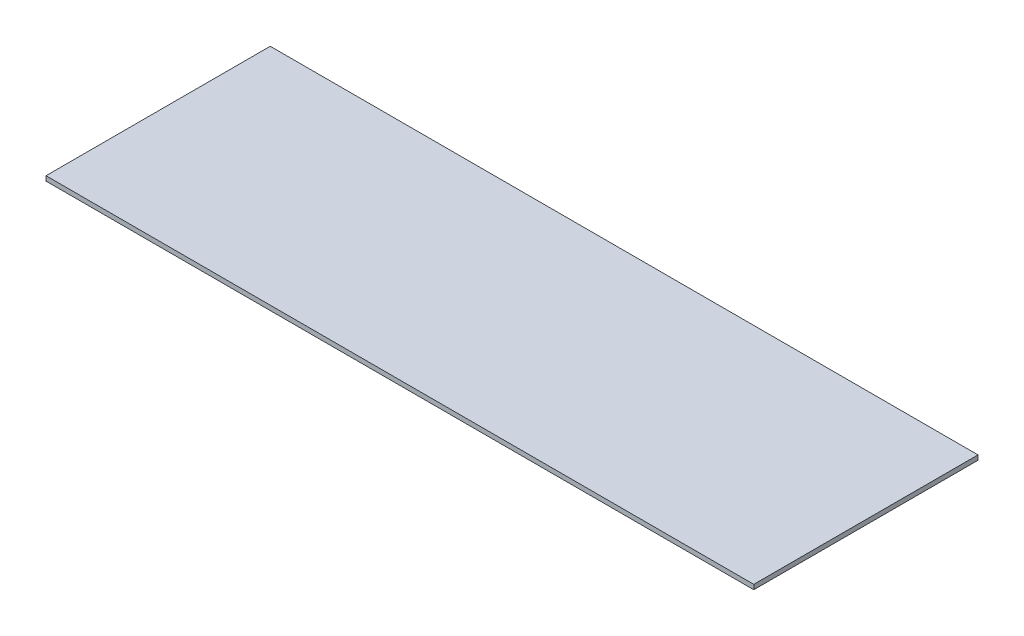
ISO-10303-21;
HEADER;
FILE_DESCRIPTION(('STEP AP214'),'2;1');
FILE_NAME('part.step','',(''),(''),'','','');
FILE_SCHEMA(('AUTOMOTIVE_DESIGN { 1 0 10303 214 1 1 1 1 }'));
ENDSEC;
DATA;
#1=APPLICATION_CONTEXT('core data for automotive mechanical design processes');
#2=APPLICATION_PROTOCOL_DEFINITION('international standard','automotive_design',2000,#1);
#3=PRODUCT_CONTEXT('',#1,'mechanical');
#4=PRODUCT('Part','Part','',(#3));
#5=PRODUCT_RELATED_PRODUCT_CATEGORY('part','',(#4));
#6=PRODUCT_DEFINITION_FORMATION('','',#4);
#7=PRODUCT_DEFINITION_CONTEXT('part definition',#1,'design');
#8=PRODUCT_DEFINITION('design','',#6,#7);
#9=PRODUCT_DEFINITION_SHAPE('','',#8);
#10=(LENGTH_UNIT() NAMED_UNIT(*) SI_UNIT(.MILLI.,.METRE.));
#11=(NAMED_UNIT(*) PLANE_ANGLE_UNIT() SI_UNIT($,.RADIAN.));
#12=(NAMED_UNIT(*) SI_UNIT($,.STERADIAN.) SOLID_ANGLE_UNIT());
#13=UNCERTAINTY_MEASURE_WITH_UNIT(LENGTH_MEASURE(1.E-05),#10,'distance_accuracy_value','');
#14=(GEOMETRIC_REPRESENTATION_CONTEXT(3) GLOBAL_UNCERTAINTY_ASSIGNED_CONTEXT((#13)) GLOBAL_UNIT_ASSIGNED_CONTEXT((#10,
#11,#12)) REPRESENTATION_CONTEXT('',''));
#15=CARTESIAN_POINT('',(0.,0.,0.));
#16=DIRECTION('',(0.,0.,1.));
#17=DIRECTION('',(1.,0.,0.));
#18=AXIS2_PLACEMENT_3D('',#15,#16,#17);
#19=CARTESIAN_POINT('',(-119.694421821047,-1.5875,-37.9212057120734));
#20=DIRECTION('',(-1.,0.,0.));
#21=DIRECTION('',(0.,0.,1.));
#22=AXIS2_PLACEMENT_3D('',#19,#20,#21);
#23=PLANE('',#22);
#24=DIRECTION('',(0.,0.,1.));
#25=VECTOR('',#24,1.);
#26=CARTESIAN_POINT('',(-119.694421821047,0.,-37.9212057120734));
#27=LINE('',#26,#25);
#28=CARTESIAN_POINT('',(-119.694421821047,0.,-37.9212057120734));
#29=VERTEX_POINT('',#28);
#30=CARTESIAN_POINT('',(-119.694421821047,0.,37.9212057120734));
#31=VERTEX_POINT('',#30);
#32=EDGE_CURVE('E96',#29,#31,#27,.T.);
#33=ORIENTED_EDGE('',*,*,#32,.F.);
#34=DIRECTION('',(0.,1.,0.));
#35=VECTOR('',#34,1.);
#36=CARTESIAN_POINT('',(-119.694421821047,-1.5875,-37.9212057120734));
#37=LINE('',#36,#35);
#38=CARTESIAN_POINT('',(-119.694421821047,-1.5875,-37.9212057120734));
#39=VERTEX_POINT('',#38);
#40=EDGE_CURVE('E11',#39,#29,#37,.T.);
#41=ORIENTED_EDGE('',*,*,#40,.F.);
#42=DIRECTION('',(0.,0.,1.));
#43=VECTOR('',#42,1.);
#44=CARTESIAN_POINT('',(-119.694421821047,-1.5875,-37.9212057120734));
#45=LINE('',#44,#43);
#46=CARTESIAN_POINT('',(-119.694421821047,-1.5875,37.9212057120734));
#47=VERTEX_POINT('',#46);
#48=EDGE_CURVE('E90',#39,#47,#45,.T.);
#49=ORIENTED_EDGE('',*,*,#48,.T.);
#50=DIRECTION('',(0.,1.,0.));
#51=VECTOR('',#50,1.);
#52=CARTESIAN_POINT('',(-119.694421821047,-1.5875,37.9212057120734));
#53=LINE('',#52,#51);
#54=EDGE_CURVE('E35',#47,#31,#53,.T.);
#55=ORIENTED_EDGE('',*,*,#54,.T.);
#56=EDGE_LOOP('',(#33,#41,#49,#55));
#57=FACE_BOUND('',#56,.T.);
#58=ADVANCED_FACE('F32',(#57),#23,.T.);
#59=CARTESIAN_POINT('',(-119.694421821047,-1.5875,-37.9212057120734));
#60=DIRECTION('',(0.,0.,-1.));
#61=DIRECTION('',(-1.,0.,0.));
#62=AXIS2_PLACEMENT_3D('',#59,#60,#61);
#63=PLANE('',#62);
#64=DIRECTION('',(-1.,0.,0.));
#65=VECTOR('',#64,1.);
#66=CARTESIAN_POINT('',(-119.694421821047,0.,-37.9212057120734));
#67=LINE('',#66,#65);
#68=CARTESIAN_POINT('',(119.694421821047,0.,-37.9212057120734));
#69=VERTEX_POINT('',#68);
#70=EDGE_CURVE('E92',#69,#29,#67,.T.);
#71=ORIENTED_EDGE('',*,*,#70,.F.);
#72=DIRECTION('',(0.,1.,0.));
#73=VECTOR('',#72,1.);
#74=CARTESIAN_POINT('',(119.694421821047,-1.5875,-37.9212057120734));
#75=LINE('',#74,#73);
#76=CARTESIAN_POINT('',(119.694421821047,-1.5875,-37.9212057120734));
#77=VERTEX_POINT('',#76);
#78=EDGE_CURVE('E41',#77,#69,#75,.T.);
#79=ORIENTED_EDGE('',*,*,#78,.F.);
#80=DIRECTION('',(-1.,0.,0.));
#81=VECTOR('',#80,1.);
#82=CARTESIAN_POINT('',(-119.694421821047,-1.5875,-37.9212057120734));
#83=LINE('',#82,#81);
#84=EDGE_CURVE('E87',#77,#39,#83,.T.);
#85=ORIENTED_EDGE('',*,*,#84,.T.);
#86=ORIENTED_EDGE('',*,*,#40,.T.);
#87=EDGE_LOOP('',(#71,#79,#85,#86));
#88=FACE_BOUND('',#87,.T.);
#89=ADVANCED_FACE('F106',(#88),#63,.T.);
#90=CARTESIAN_POINT('',(119.694421821047,-1.5875,-37.9212057120734));
#91=DIRECTION('',(1.,0.,0.));
#92=DIRECTION('',(0.,0.,-1.));
#93=AXIS2_PLACEMENT_3D('',#90,#91,#92);
#94=PLANE('',#93);
#95=DIRECTION('',(0.,0.,-1.));
#96=VECTOR('',#95,1.);
#97=CARTESIAN_POINT('',(119.694421821047,0.,-37.9212057120734));
#98=LINE('',#97,#96);
#99=CARTESIAN_POINT('',(119.694421821047,0.,37.9212057120734));
#100=VERTEX_POINT('',#99);
#101=EDGE_CURVE('E82',#100,#69,#98,.T.);
#102=ORIENTED_EDGE('',*,*,#101,.F.);
#103=DIRECTION('',(0.,1.,0.));
#104=VECTOR('',#103,1.);
#105=CARTESIAN_POINT('',(119.694421821047,-1.5875,37.9212057120734));
#106=LINE('',#105,#104);
#107=CARTESIAN_POINT('',(119.694421821047,-1.5875,37.9212057120734));
#108=VERTEX_POINT('',#107);
#109=EDGE_CURVE('E77',#108,#100,#106,.T.);
#110=ORIENTED_EDGE('',*,*,#109,.F.);
#111=DIRECTION('',(0.,0.,-1.));
#112=VECTOR('',#111,1.);
#113=CARTESIAN_POINT('',(119.694421821047,-1.5875,-37.9212057120734));
#114=LINE('',#113,#112);
#115=EDGE_CURVE('E80',#108,#77,#114,.T.);
#116=ORIENTED_EDGE('',*,*,#115,.T.);
#117=ORIENTED_EDGE('',*,*,#78,.T.);
#118=EDGE_LOOP('',(#102,#110,#116,#117));
#119=FACE_BOUND('',#118,.T.);
#120=ADVANCED_FACE('F79',(#119),#94,.T.);
#121=CARTESIAN_POINT('',(-119.694421821047,-1.5875,37.9212057120734));
#122=DIRECTION('',(0.,0.,1.));
#123=DIRECTION('',(1.,0.,0.));
#124=AXIS2_PLACEMENT_3D('',#121,#122,#123);
#125=PLANE('',#124);
#126=DIRECTION('',(1.,0.,0.));
#127=VECTOR('',#126,1.);
#128=CARTESIAN_POINT('',(-119.694421821047,0.,37.9212057120734));
#129=LINE('',#128,#127);
#130=EDGE_CURVE('E99',#31,#100,#129,.T.);
#131=ORIENTED_EDGE('',*,*,#130,.F.);
#132=ORIENTED_EDGE('',*,*,#54,.F.);
#133=DIRECTION('',(1.,0.,0.));
#134=VECTOR('',#133,1.);
#135=CARTESIAN_POINT('',(-119.694421821047,-1.5875,37.9212057120734));
#136=LINE('',#135,#134);
#137=EDGE_CURVE('E86',#47,#108,#136,.T.);
#138=ORIENTED_EDGE('',*,*,#137,.T.);
#139=ORIENTED_EDGE('',*,*,#109,.T.);
#140=EDGE_LOOP('',(#131,#132,#138,#139));
#141=FACE_BOUND('',#140,.T.);
#142=ADVANCED_FACE('F89',(#141),#125,.T.);
#143=CARTESIAN_POINT('',(0.,-1.5875,0.));
#144=DIRECTION('',(0.,1.,0.));
#145=DIRECTION('',(0.,0.,1.));
#146=AXIS2_PLACEMENT_3D('',#143,#144,#145);
#147=PLANE('',#146);
#148=ORIENTED_EDGE('',*,*,#48,.F.);
#149=ORIENTED_EDGE('',*,*,#84,.F.);
#150=ORIENTED_EDGE('',*,*,#115,.F.);
#151=ORIENTED_EDGE('',*,*,#137,.F.);
#152=EDGE_LOOP('',(#148,#149,#150,#151));
#153=FACE_BOUND('',#152,.T.);
#154=ADVANCED_FACE('F85',(#153),#147,.F.);
#155=CARTESIAN_POINT('',(0.,0.,0.));
#156=DIRECTION('',(0.,1.,0.));
#157=DIRECTION('',(0.,0.,1.));
#158=AXIS2_PLACEMENT_3D('',#155,#156,#157);
#159=PLANE('',#158);
#160=ORIENTED_EDGE('',*,*,#32,.T.);
#161=ORIENTED_EDGE('',*,*,#130,.T.);
#162=ORIENTED_EDGE('',*,*,#101,.T.);
#163=ORIENTED_EDGE('',*,*,#70,.T.);
#164=EDGE_LOOP('',(#160,#161,#162,#163));
#165=FACE_BOUND('',#164,.T.);
#166=ADVANCED_FACE('F105',(#165),#159,.T.);
#167=CLOSED_SHELL('',(#58,#89,#120,#142,#154,#166));
#168=MANIFOLD_SOLID_BREP('B2',#167);
#169=ADVANCED_BREP_SHAPE_REPRESENTATION('',(#18,#168),#14);
#170=SHAPE_DEFINITION_REPRESENTATION(#9,#169);
ENDSEC;
END-ISO-10303-21;
